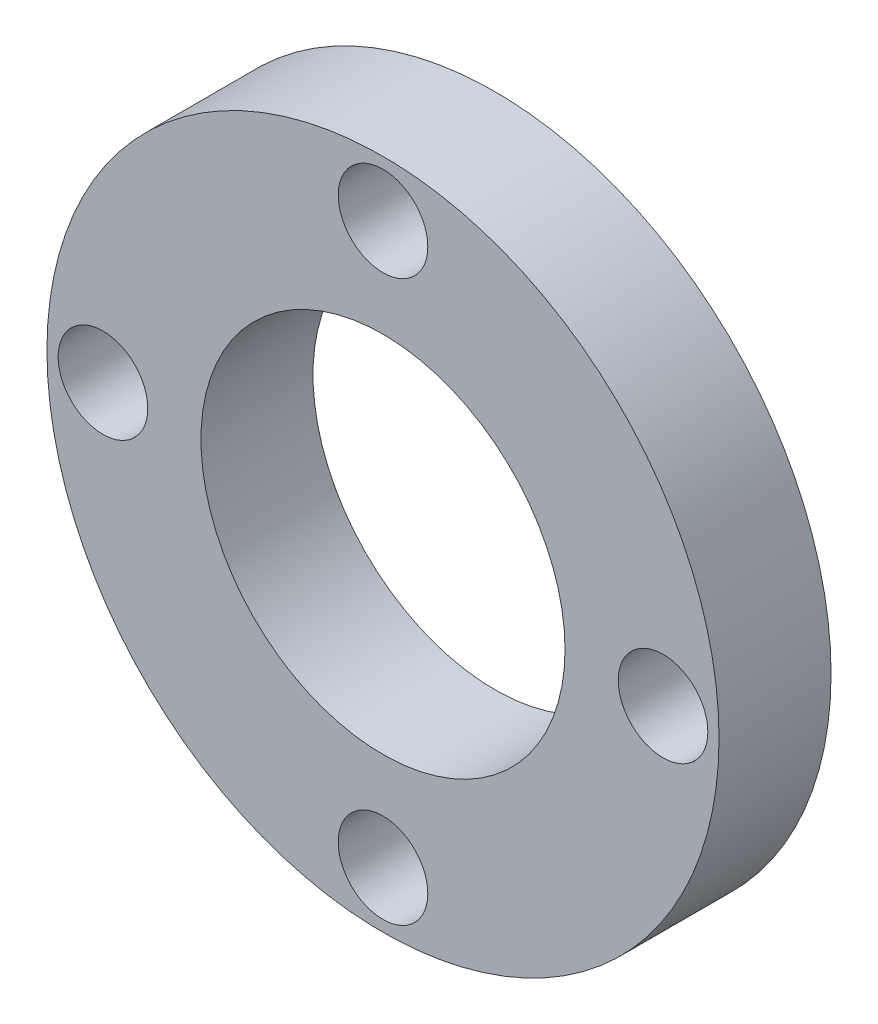
ISO-10303-21;
HEADER;
FILE_DESCRIPTION(('STEP AP214'),'2;1');
FILE_NAME('part.step','',(''),(''),'','','');
FILE_SCHEMA(('AUTOMOTIVE_DESIGN { 1 0 10303 214 1 1 1 1 }'));
ENDSEC;
DATA;
#1=APPLICATION_CONTEXT('core data for automotive mechanical design processes');
#2=APPLICATION_PROTOCOL_DEFINITION('international standard','automotive_design',2000,#1);
#3=PRODUCT_CONTEXT('',#1,'mechanical');
#4=PRODUCT('Part','Part','',(#3));
#5=PRODUCT_RELATED_PRODUCT_CATEGORY('part','',(#4));
#6=PRODUCT_DEFINITION_FORMATION('','',#4);
#7=PRODUCT_DEFINITION_CONTEXT('part definition',#1,'design');
#8=PRODUCT_DEFINITION('design','',#6,#7);
#9=PRODUCT_DEFINITION_SHAPE('','',#8);
#10=(LENGTH_UNIT() NAMED_UNIT(*) SI_UNIT(.MILLI.,.METRE.));
#11=(NAMED_UNIT(*) PLANE_ANGLE_UNIT() SI_UNIT($,.RADIAN.));
#12=(NAMED_UNIT(*) SI_UNIT($,.STERADIAN.) SOLID_ANGLE_UNIT());
#13=UNCERTAINTY_MEASURE_WITH_UNIT(LENGTH_MEASURE(1.E-05),#10,'distance_accuracy_value','');
#14=(GEOMETRIC_REPRESENTATION_CONTEXT(3) GLOBAL_UNCERTAINTY_ASSIGNED_CONTEXT((#13)) GLOBAL_UNIT_ASSIGNED_CONTEXT((#10,
#11,#12)) REPRESENTATION_CONTEXT('',''));
#15=CARTESIAN_POINT('',(0.,0.,0.));
#16=DIRECTION('',(0.,0.,1.));
#17=DIRECTION('',(1.,0.,0.));
#18=AXIS2_PLACEMENT_3D('',#15,#16,#17);
#19=CARTESIAN_POINT('',(0.,0.,4.));
#20=DIRECTION('',(0.,0.,1.));
#21=DIRECTION('',(1.,0.,0.));
#22=AXIS2_PLACEMENT_3D('',#19,#20,#21);
#23=PLANE('',#22);
#24=CARTESIAN_POINT('',(0.,-10.,4.));
#25=DIRECTION('',(0.,0.,1.));
#26=DIRECTION('',(1.,0.,0.));
#27=AXIS2_PLACEMENT_3D('',#24,#25,#26);
#28=CIRCLE('',#27,1.60000000000007);
#29=CARTESIAN_POINT('',(1.60000000000007,-10.,4.));
#30=VERTEX_POINT('',#29);
#31=EDGE_CURVE('E65',#30,#30,#28,.T.);
#32=ORIENTED_EDGE('',*,*,#31,.F.);
#33=EDGE_LOOP('',(#32));
#34=FACE_BOUND('',#33,.T.);
#35=CARTESIAN_POINT('',(0.,10.,4.));
#36=DIRECTION('',(0.,0.,1.));
#37=DIRECTION('',(1.,0.,0.));
#38=AXIS2_PLACEMENT_3D('',#35,#36,#37);
#39=CIRCLE('',#38,1.6);
#40=CARTESIAN_POINT('',(1.6,10.,4.));
#41=VERTEX_POINT('',#40);
#42=EDGE_CURVE('E53',#41,#41,#39,.T.);
#43=ORIENTED_EDGE('',*,*,#42,.F.);
#44=EDGE_LOOP('',(#43));
#45=FACE_BOUND('',#44,.T.);
#46=CARTESIAN_POINT('',(0.,0.,4.));
#47=DIRECTION('',(0.,0.,1.));
#48=DIRECTION('',(1.,0.,0.));
#49=AXIS2_PLACEMENT_3D('',#46,#47,#48);
#50=CIRCLE('',#49,12.);
#51=CARTESIAN_POINT('',(12.,0.,4.));
#52=VERTEX_POINT('',#51);
#53=EDGE_CURVE('E10',#52,#52,#50,.T.);
#54=ORIENTED_EDGE('',*,*,#53,.T.);
#55=EDGE_LOOP('',(#54));
#56=FACE_BOUND('',#55,.T.);
#57=CARTESIAN_POINT('',(0.,0.,4.));
#58=DIRECTION('',(0.,0.,1.));
#59=DIRECTION('',(1.,0.,0.));
#60=AXIS2_PLACEMENT_3D('',#57,#58,#59);
#61=CIRCLE('',#60,6.5);
#62=CARTESIAN_POINT('',(6.5,0.,4.));
#63=VERTEX_POINT('',#62);
#64=EDGE_CURVE('E48',#63,#63,#61,.T.);
#65=ORIENTED_EDGE('',*,*,#64,.F.);
#66=EDGE_LOOP('',(#65));
#67=FACE_BOUND('',#66,.T.);
#68=CARTESIAN_POINT('',(10.,0.,4.));
#69=DIRECTION('',(0.,0.,1.));
#70=DIRECTION('',(1.,0.,0.));
#71=AXIS2_PLACEMENT_3D('',#68,#69,#70);
#72=CIRCLE('',#71,1.6);
#73=CARTESIAN_POINT('',(11.6,0.,4.));
#74=VERTEX_POINT('',#73);
#75=EDGE_CURVE('E59',#74,#74,#72,.T.);
#76=ORIENTED_EDGE('',*,*,#75,.F.);
#77=EDGE_LOOP('',(#76));
#78=FACE_BOUND('',#77,.T.);
#79=CARTESIAN_POINT('',(-10.,0.,4.));
#80=DIRECTION('',(0.,0.,1.));
#81=DIRECTION('',(1.,0.,0.));
#82=AXIS2_PLACEMENT_3D('',#79,#80,#81);
#83=CIRCLE('',#82,1.6000000000001);
#84=CARTESIAN_POINT('',(-8.3999999999999,0.,4.));
#85=VERTEX_POINT('',#84);
#86=EDGE_CURVE('E71',#85,#85,#83,.T.);
#87=ORIENTED_EDGE('',*,*,#86,.F.);
#88=EDGE_LOOP('',(#87));
#89=FACE_BOUND('',#88,.T.);
#90=ADVANCED_FACE('F37',(#34,#45,#56,#67,#78,#89),#23,.T.);
#91=CARTESIAN_POINT('',(0.,0.,0.));
#92=DIRECTION('',(0.,0.,1.));
#93=DIRECTION('',(1.,0.,0.));
#94=AXIS2_PLACEMENT_3D('',#91,#92,#93);
#95=PLANE('',#94);
#96=CARTESIAN_POINT('',(0.,0.,0.));
#97=DIRECTION('',(0.,0.,1.));
#98=DIRECTION('',(1.,0.,0.));
#99=AXIS2_PLACEMENT_3D('',#96,#97,#98);
#100=CIRCLE('',#99,12.);
#101=CARTESIAN_POINT('',(12.,0.,0.));
#102=VERTEX_POINT('',#101);
#103=EDGE_CURVE('E41',#102,#102,#100,.T.);
#104=ORIENTED_EDGE('',*,*,#103,.F.);
#105=EDGE_LOOP('',(#104));
#106=FACE_BOUND('',#105,.T.);
#107=CARTESIAN_POINT('',(0.,0.,0.));
#108=DIRECTION('',(0.,0.,1.));
#109=DIRECTION('',(1.,0.,0.));
#110=AXIS2_PLACEMENT_3D('',#107,#108,#109);
#111=CIRCLE('',#110,6.5);
#112=CARTESIAN_POINT('',(6.5,0.,0.));
#113=VERTEX_POINT('',#112);
#114=EDGE_CURVE('E50',#113,#113,#111,.T.);
#115=ORIENTED_EDGE('',*,*,#114,.T.);
#116=EDGE_LOOP('',(#115));
#117=FACE_BOUND('',#116,.T.);
#118=CARTESIAN_POINT('',(0.,10.,0.));
#119=DIRECTION('',(0.,0.,1.));
#120=DIRECTION('',(1.,0.,0.));
#121=AXIS2_PLACEMENT_3D('',#118,#119,#120);
#122=CIRCLE('',#121,1.6);
#123=CARTESIAN_POINT('',(1.6,10.,0.));
#124=VERTEX_POINT('',#123);
#125=EDGE_CURVE('E56',#124,#124,#122,.T.);
#126=ORIENTED_EDGE('',*,*,#125,.T.);
#127=EDGE_LOOP('',(#126));
#128=FACE_BOUND('',#127,.T.);
#129=CARTESIAN_POINT('',(10.,0.,0.));
#130=DIRECTION('',(0.,0.,1.));
#131=DIRECTION('',(1.,0.,0.));
#132=AXIS2_PLACEMENT_3D('',#129,#130,#131);
#133=CIRCLE('',#132,1.6);
#134=CARTESIAN_POINT('',(11.6,0.,0.));
#135=VERTEX_POINT('',#134);
#136=EDGE_CURVE('E62',#135,#135,#133,.T.);
#137=ORIENTED_EDGE('',*,*,#136,.T.);
#138=EDGE_LOOP('',(#137));
#139=FACE_BOUND('',#138,.T.);
#140=CARTESIAN_POINT('',(0.,-10.,0.));
#141=DIRECTION('',(0.,0.,1.));
#142=DIRECTION('',(1.,0.,0.));
#143=AXIS2_PLACEMENT_3D('',#140,#141,#142);
#144=CIRCLE('',#143,1.60000000000007);
#145=CARTESIAN_POINT('',(1.60000000000007,-10.,0.));
#146=VERTEX_POINT('',#145);
#147=EDGE_CURVE('E68',#146,#146,#144,.T.);
#148=ORIENTED_EDGE('',*,*,#147,.T.);
#149=EDGE_LOOP('',(#148));
#150=FACE_BOUND('',#149,.T.);
#151=CARTESIAN_POINT('',(-10.,0.,0.));
#152=DIRECTION('',(0.,0.,1.));
#153=DIRECTION('',(1.,0.,0.));
#154=AXIS2_PLACEMENT_3D('',#151,#152,#153);
#155=CIRCLE('',#154,1.6000000000001);
#156=CARTESIAN_POINT('',(-8.3999999999999,0.,0.));
#157=VERTEX_POINT('',#156);
#158=EDGE_CURVE('E74',#157,#157,#155,.T.);
#159=ORIENTED_EDGE('',*,*,#158,.T.);
#160=EDGE_LOOP('',(#159));
#161=FACE_BOUND('',#160,.T.);
#162=ADVANCED_FACE('F84',(#106,#117,#128,#139,#150,#161),#95,.F.);
#163=CARTESIAN_POINT('',(0.,0.,4.));
#164=DIRECTION('',(0.,0.,-1.));
#165=DIRECTION('',(-1.,0.,0.));
#166=AXIS2_PLACEMENT_3D('',#163,#164,#165);
#167=CYLINDRICAL_SURFACE('',#166,12.);
#168=ORIENTED_EDGE('',*,*,#53,.F.);
#169=EDGE_LOOP('',(#168));
#170=FACE_BOUND('',#169,.T.);
#171=ORIENTED_EDGE('',*,*,#103,.T.);
#172=EDGE_LOOP('',(#171));
#173=FACE_BOUND('',#172,.T.);
#174=ADVANCED_FACE('F39',(#170,#173),#167,.T.);
#175=CARTESIAN_POINT('',(0.,0.,4.));
#176=DIRECTION('',(0.,0.,-1.));
#177=DIRECTION('',(-1.,0.,0.));
#178=AXIS2_PLACEMENT_3D('',#175,#176,#177);
#179=CYLINDRICAL_SURFACE('',#178,6.5);
#180=ORIENTED_EDGE('',*,*,#64,.T.);
#181=EDGE_LOOP('',(#180));
#182=FACE_BOUND('',#181,.T.);
#183=ORIENTED_EDGE('',*,*,#114,.F.);
#184=EDGE_LOOP('',(#183));
#185=FACE_BOUND('',#184,.T.);
#186=ADVANCED_FACE('F94',(#182,#185),#179,.F.);
#187=CARTESIAN_POINT('',(0.,10.,4.));
#188=DIRECTION('',(0.,0.,-1.));
#189=DIRECTION('',(-1.,0.,0.));
#190=AXIS2_PLACEMENT_3D('',#187,#188,#189);
#191=CYLINDRICAL_SURFACE('',#190,1.6);
#192=ORIENTED_EDGE('',*,*,#42,.T.);
#193=EDGE_LOOP('',(#192));
#194=FACE_BOUND('',#193,.T.);
#195=ORIENTED_EDGE('',*,*,#125,.F.);
#196=EDGE_LOOP('',(#195));
#197=FACE_BOUND('',#196,.T.);
#198=ADVANCED_FACE('F97',(#194,#197),#191,.F.);
#199=CARTESIAN_POINT('',(10.,0.,4.));
#200=DIRECTION('',(0.,0.,-1.));
#201=DIRECTION('',(-1.,0.,0.));
#202=AXIS2_PLACEMENT_3D('',#199,#200,#201);
#203=CYLINDRICAL_SURFACE('',#202,1.6);
#204=ORIENTED_EDGE('',*,*,#75,.T.);
#205=EDGE_LOOP('',(#204));
#206=FACE_BOUND('',#205,.T.);
#207=ORIENTED_EDGE('',*,*,#136,.F.);
#208=EDGE_LOOP('',(#207));
#209=FACE_BOUND('',#208,.T.);
#210=ADVANCED_FACE('F101',(#206,#209),#203,.F.);
#211=CARTESIAN_POINT('',(0.,-10.,4.));
#212=DIRECTION('',(0.,0.,-1.));
#213=DIRECTION('',(-1.,0.,0.));
#214=AXIS2_PLACEMENT_3D('',#211,#212,#213);
#215=CYLINDRICAL_SURFACE('',#214,1.60000000000007);
#216=ORIENTED_EDGE('',*,*,#31,.T.);
#217=EDGE_LOOP('',(#216));
#218=FACE_BOUND('',#217,.T.);
#219=ORIENTED_EDGE('',*,*,#147,.F.);
#220=EDGE_LOOP('',(#219));
#221=FACE_BOUND('',#220,.T.);
#222=ADVANCED_FACE('F105',(#218,#221),#215,.F.);
#223=CARTESIAN_POINT('',(-10.,0.,4.));
#224=DIRECTION('',(0.,0.,-1.));
#225=DIRECTION('',(-1.,0.,0.));
#226=AXIS2_PLACEMENT_3D('',#223,#224,#225);
#227=CYLINDRICAL_SURFACE('',#226,1.6000000000001);
#228=ORIENTED_EDGE('',*,*,#86,.T.);
#229=EDGE_LOOP('',(#228));
#230=FACE_BOUND('',#229,.T.);
#231=ORIENTED_EDGE('',*,*,#158,.F.);
#232=EDGE_LOOP('',(#231));
#233=FACE_BOUND('',#232,.T.);
#234=ADVANCED_FACE('F80',(#230,#233),#227,.F.);
#235=CLOSED_SHELL('',(#90,#162,#174,#186,#198,#210,#222,#234));
#236=MANIFOLD_SOLID_BREP('B2',#235);
#237=ADVANCED_BREP_SHAPE_REPRESENTATION('',(#18,#236),#14);
#238=SHAPE_DEFINITION_REPRESENTATION(#9,#237);
ENDSEC;
END-ISO-10303-21;
